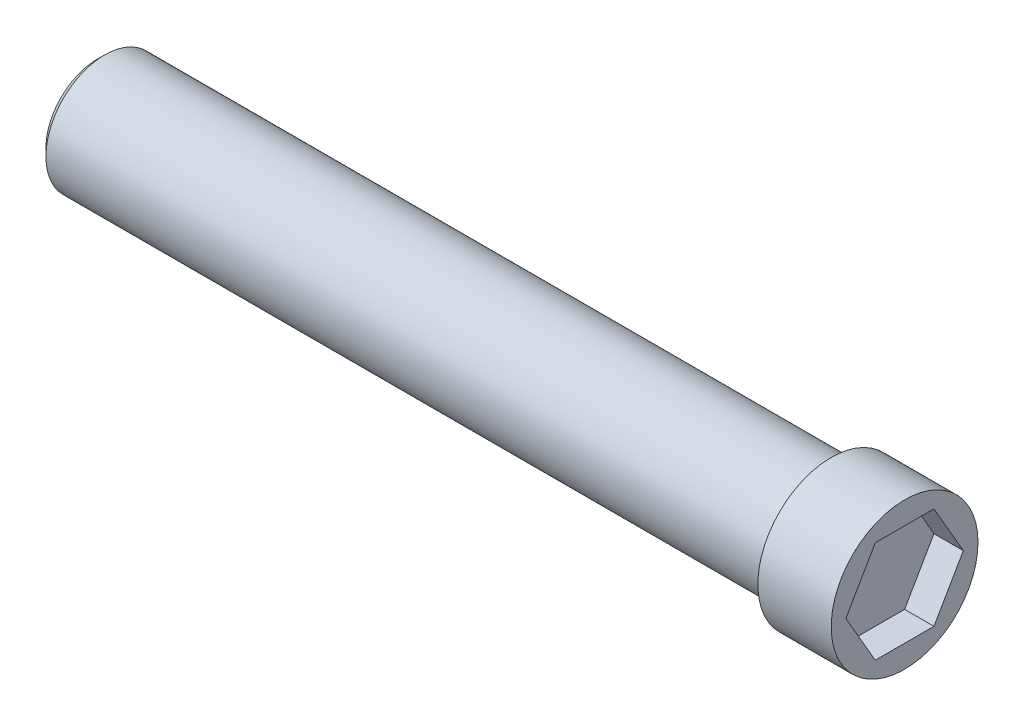
ISO-10303-21;
HEADER;
FILE_DESCRIPTION(('STEP AP214'),'2;1');
FILE_NAME('part.step','',(''),(''),'','','');
FILE_SCHEMA(('AUTOMOTIVE_DESIGN { 1 0 10303 214 1 1 1 1 }'));
ENDSEC;
DATA;
#1=APPLICATION_CONTEXT('core data for automotive mechanical design processes');
#2=APPLICATION_PROTOCOL_DEFINITION('international standard','automotive_design',2000,#1);
#3=PRODUCT_CONTEXT('',#1,'mechanical');
#4=PRODUCT('Part','Part','',(#3));
#5=PRODUCT_RELATED_PRODUCT_CATEGORY('part','',(#4));
#6=PRODUCT_DEFINITION_FORMATION('','',#4);
#7=PRODUCT_DEFINITION_CONTEXT('part definition',#1,'design');
#8=PRODUCT_DEFINITION('design','',#6,#7);
#9=PRODUCT_DEFINITION_SHAPE('','',#8);
#10=(LENGTH_UNIT() NAMED_UNIT(*) SI_UNIT(.MILLI.,.METRE.));
#11=(NAMED_UNIT(*) PLANE_ANGLE_UNIT() SI_UNIT($,.RADIAN.));
#12=(NAMED_UNIT(*) SI_UNIT($,.STERADIAN.) SOLID_ANGLE_UNIT());
#13=UNCERTAINTY_MEASURE_WITH_UNIT(LENGTH_MEASURE(1.E-05),#10,'distance_accuracy_value','');
#14=(GEOMETRIC_REPRESENTATION_CONTEXT(3) GLOBAL_UNCERTAINTY_ASSIGNED_CONTEXT((#13)) GLOBAL_UNIT_ASSIGNED_CONTEXT((#10,
#11,#12)) REPRESENTATION_CONTEXT('',''));
#15=CARTESIAN_POINT('',(0.,0.,0.));
#16=DIRECTION('',(0.,0.,1.));
#17=DIRECTION('',(1.,0.,0.));
#18=AXIS2_PLACEMENT_3D('',#15,#16,#17);
#19=CARTESIAN_POINT('',(50.,0.,0.));
#20=DIRECTION('',(-1.,0.,0.));
#21=DIRECTION('',(0.,0.,1.));
#22=AXIS2_PLACEMENT_3D('',#19,#20,#21);
#23=CYLINDRICAL_SURFACE('',#22,4.);
#24=CARTESIAN_POINT('',(0.5,0.,0.));
#25=DIRECTION('',(1.,0.,0.));
#26=DIRECTION('',(0.,0.,-1.));
#27=AXIS2_PLACEMENT_3D('',#24,#25,#26);
#28=CIRCLE('',#27,4.);
#29=CARTESIAN_POINT('',(0.5,0.,-4.));
#30=VERTEX_POINT('',#29);
#31=EDGE_CURVE('E43',#30,#30,#28,.T.);
#32=ORIENTED_EDGE('',*,*,#31,.T.);
#33=EDGE_LOOP('',(#32));
#34=FACE_BOUND('',#33,.T.);
#35=CARTESIAN_POINT('',(50.,0.,0.));
#36=DIRECTION('',(1.,0.,0.));
#37=DIRECTION('',(0.,0.,-1.));
#38=AXIS2_PLACEMENT_3D('',#35,#36,#37);
#39=CIRCLE('',#38,4.);
#40=CARTESIAN_POINT('',(50.,0.,-4.));
#41=VERTEX_POINT('',#40);
#42=EDGE_CURVE('E146',#41,#41,#39,.T.);
#43=ORIENTED_EDGE('',*,*,#42,.F.);
#44=EDGE_LOOP('',(#43));
#45=FACE_BOUND('',#44,.T.);
#46=ADVANCED_FACE('F35',(#34,#45),#23,.T.);
#47=CARTESIAN_POINT('',(0.,0.,0.));
#48=DIRECTION('',(1.,0.,0.));
#49=DIRECTION('',(0.,0.,-1.));
#50=AXIS2_PLACEMENT_3D('',#47,#48,#49);
#51=PLANE('',#50);
#52=CARTESIAN_POINT('',(0.,0.,0.));
#53=DIRECTION('',(1.,0.,0.));
#54=DIRECTION('',(0.,0.,-1.));
#55=AXIS2_PLACEMENT_3D('',#52,#53,#54);
#56=CIRCLE('',#55,3.5);
#57=CARTESIAN_POINT('',(0.,0.,-3.5));
#58=VERTEX_POINT('',#57);
#59=EDGE_CURVE('E11',#58,#58,#56,.F.);
#60=ORIENTED_EDGE('',*,*,#59,.T.);
#61=EDGE_LOOP('',(#60));
#62=FACE_BOUND('',#61,.T.);
#63=ADVANCED_FACE('F164',(#62),#51,.F.);
#64=CARTESIAN_POINT('',(50.,0.,0.));
#65=DIRECTION('',(1.,0.,0.));
#66=DIRECTION('',(0.,0.,-1.));
#67=AXIS2_PLACEMENT_3D('',#64,#65,#66);
#68=PLANE('',#67);
#69=CARTESIAN_POINT('',(50.,0.,0.));
#70=DIRECTION('',(1.,0.,0.));
#71=DIRECTION('',(0.,0.,-1.));
#72=AXIS2_PLACEMENT_3D('',#69,#70,#71);
#73=CIRCLE('',#72,5.);
#74=CARTESIAN_POINT('',(50.,0.,-5.));
#75=VERTEX_POINT('',#74);
#76=EDGE_CURVE('E137',#75,#75,#73,.T.);
#77=ORIENTED_EDGE('',*,*,#76,.F.);
#78=EDGE_LOOP('',(#77));
#79=FACE_BOUND('',#78,.T.);
#80=ORIENTED_EDGE('',*,*,#42,.T.);
#81=EDGE_LOOP('',(#80));
#82=FACE_BOUND('',#81,.T.);
#83=ADVANCED_FACE('F168',(#79,#82),#68,.F.);
#84=CARTESIAN_POINT('',(55.,0.,0.));
#85=DIRECTION('',(-1.,0.,0.));
#86=DIRECTION('',(0.,0.,1.));
#87=AXIS2_PLACEMENT_3D('',#84,#85,#86);
#88=CYLINDRICAL_SURFACE('',#87,5.);
#89=CARTESIAN_POINT('',(55.,0.,0.));
#90=DIRECTION('',(1.,0.,0.));
#91=DIRECTION('',(0.,0.,-1.));
#92=AXIS2_PLACEMENT_3D('',#89,#90,#91);
#93=CIRCLE('',#92,5.);
#94=CARTESIAN_POINT('',(55.,0.,-5.));
#95=VERTEX_POINT('',#94);
#96=EDGE_CURVE('E143',#95,#95,#93,.T.);
#97=ORIENTED_EDGE('',*,*,#96,.F.);
#98=EDGE_LOOP('',(#97));
#99=FACE_BOUND('',#98,.T.);
#100=ORIENTED_EDGE('',*,*,#76,.T.);
#101=EDGE_LOOP('',(#100));
#102=FACE_BOUND('',#101,.T.);
#103=ADVANCED_FACE('F172',(#99,#102),#88,.T.);
#104=CARTESIAN_POINT('',(55.,0.,0.));
#105=DIRECTION('',(1.,0.,0.));
#106=DIRECTION('',(0.,0.,-1.));
#107=AXIS2_PLACEMENT_3D('',#104,#105,#106);
#108=PLANE('',#107);
#109=DIRECTION('',(0.,0.866025403784439,-0.5));
#110=VECTOR('',#109,1.);
#111=CARTESIAN_POINT('',(55.,-3.46410161513775,-2.));
#112=LINE('',#111,#110);
#113=CARTESIAN_POINT('',(55.,-3.46410161513775,-2.));
#114=VERTEX_POINT('',#113);
#115=CARTESIAN_POINT('',(55.,0.,-4.));
#116=VERTEX_POINT('',#115);
#117=EDGE_CURVE('E50',#114,#116,#112,.T.);
#118=ORIENTED_EDGE('',*,*,#117,.F.);
#119=DIRECTION('',(0.,0.,-1.));
#120=VECTOR('',#119,1.);
#121=CARTESIAN_POINT('',(55.,-3.46410161513775,2.));
#122=LINE('',#121,#120);
#123=CARTESIAN_POINT('',(55.,-3.46410161513775,2.));
#124=VERTEX_POINT('',#123);
#125=EDGE_CURVE('E133',#124,#114,#122,.T.);
#126=ORIENTED_EDGE('',*,*,#125,.F.);
#127=DIRECTION('',(0.,-0.866025403784439,-0.5));
#128=VECTOR('',#127,1.);
#129=CARTESIAN_POINT('',(55.,0.,4.));
#130=LINE('',#129,#128);
#131=CARTESIAN_POINT('',(55.,0.,4.));
#132=VERTEX_POINT('',#131);
#133=EDGE_CURVE('E131',#132,#124,#130,.T.);
#134=ORIENTED_EDGE('',*,*,#133,.F.);
#135=DIRECTION('',(0.,-0.866025403784439,0.5));
#136=VECTOR('',#135,1.);
#137=CARTESIAN_POINT('',(55.,3.46410161513776,2.));
#138=LINE('',#137,#136);
#139=CARTESIAN_POINT('',(55.,3.46410161513776,2.));
#140=VERTEX_POINT('',#139);
#141=EDGE_CURVE('E98',#140,#132,#138,.T.);
#142=ORIENTED_EDGE('',*,*,#141,.F.);
#143=DIRECTION('',(0.,0.,1.));
#144=VECTOR('',#143,1.);
#145=CARTESIAN_POINT('',(55.,3.46410161513776,-2.));
#146=LINE('',#145,#144);
#147=CARTESIAN_POINT('',(55.,3.46410161513776,-2.));
#148=VERTEX_POINT('',#147);
#149=EDGE_CURVE('E127',#148,#140,#146,.T.);
#150=ORIENTED_EDGE('',*,*,#149,.F.);
#151=DIRECTION('',(0.,0.866025403784439,0.5));
#152=VECTOR('',#151,1.);
#153=CARTESIAN_POINT('',(55.,0.,-4.));
#154=LINE('',#153,#152);
#155=EDGE_CURVE('E124',#116,#148,#154,.T.);
#156=ORIENTED_EDGE('',*,*,#155,.F.);
#157=EDGE_LOOP('',(#118,#126,#134,#142,#150,#156));
#158=FACE_BOUND('',#157,.T.);
#159=ORIENTED_EDGE('',*,*,#96,.T.);
#160=EDGE_LOOP('',(#159));
#161=FACE_BOUND('',#160,.T.);
#162=ADVANCED_FACE('F175',(#158,#161),#108,.T.);
#163=CARTESIAN_POINT('',(53.,-3.46410161513775,-2.));
#164=DIRECTION('',(0.,-0.5,-0.866025403784439));
#165=DIRECTION('',(0.,0.866025403784439,-0.5));
#166=AXIS2_PLACEMENT_3D('',#163,#164,#165);
#167=PLANE('',#166);
#168=ORIENTED_EDGE('',*,*,#117,.T.);
#169=DIRECTION('',(1.,0.,0.));
#170=VECTOR('',#169,1.);
#171=CARTESIAN_POINT('',(53.,0.,-4.));
#172=LINE('',#171,#170);
#173=CARTESIAN_POINT('',(53.,0.,-4.));
#174=VERTEX_POINT('',#173);
#175=EDGE_CURVE('E80',#174,#116,#172,.T.);
#176=ORIENTED_EDGE('',*,*,#175,.F.);
#177=DIRECTION('',(0.,0.866025403784439,-0.5));
#178=VECTOR('',#177,1.);
#179=CARTESIAN_POINT('',(53.,-3.46410161513775,-2.));
#180=LINE('',#179,#178);
#181=CARTESIAN_POINT('',(53.,-3.46410161513775,-2.));
#182=VERTEX_POINT('',#181);
#183=EDGE_CURVE('E135',#182,#174,#180,.T.);
#184=ORIENTED_EDGE('',*,*,#183,.F.);
#185=DIRECTION('',(1.,0.,0.));
#186=VECTOR('',#185,1.);
#187=CARTESIAN_POINT('',(53.,-3.46410161513775,-2.));
#188=LINE('',#187,#186);
#189=EDGE_CURVE('E58',#182,#114,#188,.T.);
#190=ORIENTED_EDGE('',*,*,#189,.T.);
#191=EDGE_LOOP('',(#168,#176,#184,#190));
#192=FACE_BOUND('',#191,.T.);
#193=ADVANCED_FACE('F182',(#192),#167,.F.);
#194=CARTESIAN_POINT('',(53.,-3.46410161513775,2.));
#195=DIRECTION('',(0.,-1.,0.));
#196=DIRECTION('',(0.,0.,-1.));
#197=AXIS2_PLACEMENT_3D('',#194,#195,#196);
#198=PLANE('',#197);
#199=ORIENTED_EDGE('',*,*,#125,.T.);
#200=ORIENTED_EDGE('',*,*,#189,.F.);
#201=DIRECTION('',(0.,0.,-1.));
#202=VECTOR('',#201,1.);
#203=CARTESIAN_POINT('',(53.,-3.46410161513775,2.));
#204=LINE('',#203,#202);
#205=CARTESIAN_POINT('',(53.,-3.46410161513775,2.));
#206=VERTEX_POINT('',#205);
#207=EDGE_CURVE('E110',#206,#182,#204,.T.);
#208=ORIENTED_EDGE('',*,*,#207,.F.);
#209=DIRECTION('',(1.,0.,0.));
#210=VECTOR('',#209,1.);
#211=CARTESIAN_POINT('',(53.,-3.46410161513775,2.));
#212=LINE('',#211,#210);
#213=EDGE_CURVE('E102',#206,#124,#212,.T.);
#214=ORIENTED_EDGE('',*,*,#213,.T.);
#215=EDGE_LOOP('',(#199,#200,#208,#214));
#216=FACE_BOUND('',#215,.T.);
#217=ADVANCED_FACE('F186',(#216),#198,.F.);
#218=CARTESIAN_POINT('',(53.,0.,4.));
#219=DIRECTION('',(0.,-0.5,0.866025403784439));
#220=DIRECTION('',(0.,-0.866025403784439,-0.5));
#221=AXIS2_PLACEMENT_3D('',#218,#219,#220);
#222=PLANE('',#221);
#223=ORIENTED_EDGE('',*,*,#133,.T.);
#224=ORIENTED_EDGE('',*,*,#213,.F.);
#225=DIRECTION('',(0.,-0.866025403784439,-0.5));
#226=VECTOR('',#225,1.);
#227=CARTESIAN_POINT('',(53.,0.,4.));
#228=LINE('',#227,#226);
#229=CARTESIAN_POINT('',(53.,0.,4.));
#230=VERTEX_POINT('',#229);
#231=EDGE_CURVE('E106',#230,#206,#228,.T.);
#232=ORIENTED_EDGE('',*,*,#231,.F.);
#233=DIRECTION('',(1.,0.,0.));
#234=VECTOR('',#233,1.);
#235=CARTESIAN_POINT('',(53.,0.,4.));
#236=LINE('',#235,#234);
#237=EDGE_CURVE('E91',#230,#132,#236,.T.);
#238=ORIENTED_EDGE('',*,*,#237,.T.);
#239=EDGE_LOOP('',(#223,#224,#232,#238));
#240=FACE_BOUND('',#239,.T.);
#241=ADVANCED_FACE('F107',(#240),#222,.F.);
#242=CARTESIAN_POINT('',(53.,3.46410161513776,2.));
#243=DIRECTION('',(0.,0.5,0.866025403784439));
#244=DIRECTION('',(0.,-0.866025403784439,0.5));
#245=AXIS2_PLACEMENT_3D('',#242,#243,#244);
#246=PLANE('',#245);
#247=ORIENTED_EDGE('',*,*,#141,.T.);
#248=ORIENTED_EDGE('',*,*,#237,.F.);
#249=DIRECTION('',(0.,-0.866025403784439,0.5));
#250=VECTOR('',#249,1.);
#251=CARTESIAN_POINT('',(53.,3.46410161513776,2.));
#252=LINE('',#251,#250);
#253=CARTESIAN_POINT('',(53.,3.46410161513776,2.));
#254=VERTEX_POINT('',#253);
#255=EDGE_CURVE('E95',#254,#230,#252,.T.);
#256=ORIENTED_EDGE('',*,*,#255,.F.);
#257=DIRECTION('',(1.,0.,0.));
#258=VECTOR('',#257,1.);
#259=CARTESIAN_POINT('',(53.,3.46410161513776,2.));
#260=LINE('',#259,#258);
#261=EDGE_CURVE('E103',#254,#140,#260,.T.);
#262=ORIENTED_EDGE('',*,*,#261,.T.);
#263=EDGE_LOOP('',(#247,#248,#256,#262));
#264=FACE_BOUND('',#263,.T.);
#265=ADVANCED_FACE('F93',(#264),#246,.F.);
#266=CARTESIAN_POINT('',(53.,3.46410161513776,-2.));
#267=DIRECTION('',(0.,1.,0.));
#268=DIRECTION('',(0.,0.,1.));
#269=AXIS2_PLACEMENT_3D('',#266,#267,#268);
#270=PLANE('',#269);
#271=ORIENTED_EDGE('',*,*,#149,.T.);
#272=ORIENTED_EDGE('',*,*,#261,.F.);
#273=DIRECTION('',(0.,0.,1.));
#274=VECTOR('',#273,1.);
#275=CARTESIAN_POINT('',(53.,3.46410161513776,-2.));
#276=LINE('',#275,#274);
#277=CARTESIAN_POINT('',(53.,3.46410161513776,-2.));
#278=VERTEX_POINT('',#277);
#279=EDGE_CURVE('E116',#278,#254,#276,.T.);
#280=ORIENTED_EDGE('',*,*,#279,.F.);
#281=DIRECTION('',(1.,0.,0.));
#282=VECTOR('',#281,1.);
#283=CARTESIAN_POINT('',(53.,3.46410161513776,-2.));
#284=LINE('',#283,#282);
#285=EDGE_CURVE('E140',#278,#148,#284,.T.);
#286=ORIENTED_EDGE('',*,*,#285,.T.);
#287=EDGE_LOOP('',(#271,#272,#280,#286));
#288=FACE_BOUND('',#287,.T.);
#289=ADVANCED_FACE('F189',(#288),#270,.F.);
#290=CARTESIAN_POINT('',(53.,0.,-4.));
#291=DIRECTION('',(0.,0.5,-0.866025403784439));
#292=DIRECTION('',(0.,0.866025403784439,0.5));
#293=AXIS2_PLACEMENT_3D('',#290,#291,#292);
#294=PLANE('',#293);
#295=ORIENTED_EDGE('',*,*,#155,.T.);
#296=ORIENTED_EDGE('',*,*,#285,.F.);
#297=DIRECTION('',(0.,0.866025403784439,0.5));
#298=VECTOR('',#297,1.);
#299=CARTESIAN_POINT('',(53.,0.,-4.));
#300=LINE('',#299,#298);
#301=EDGE_CURVE('E118',#174,#278,#300,.T.);
#302=ORIENTED_EDGE('',*,*,#301,.F.);
#303=ORIENTED_EDGE('',*,*,#175,.T.);
#304=EDGE_LOOP('',(#295,#296,#302,#303));
#305=FACE_BOUND('',#304,.T.);
#306=ADVANCED_FACE('F160',(#305),#294,.F.);
#307=CARTESIAN_POINT('',(53.,0.,0.));
#308=DIRECTION('',(1.,0.,0.));
#309=DIRECTION('',(0.,0.,-1.));
#310=AXIS2_PLACEMENT_3D('',#307,#308,#309);
#311=PLANE('',#310);
#312=ORIENTED_EDGE('',*,*,#183,.T.);
#313=ORIENTED_EDGE('',*,*,#301,.T.);
#314=ORIENTED_EDGE('',*,*,#279,.T.);
#315=ORIENTED_EDGE('',*,*,#255,.T.);
#316=ORIENTED_EDGE('',*,*,#231,.T.);
#317=ORIENTED_EDGE('',*,*,#207,.T.);
#318=EDGE_LOOP('',(#312,#313,#314,#315,#316,#317));
#319=FACE_BOUND('',#318,.T.);
#320=ADVANCED_FACE('F113',(#319),#311,.T.);
#321=CARTESIAN_POINT('',(0.5,0.,0.));
#322=DIRECTION('',(1.,0.,0.));
#323=DIRECTION('',(0.,0.,-1.));
#324=AXIS2_PLACEMENT_3D('',#321,#322,#323);
#325=CONICAL_SURFACE('',#324,4.,0.785398163397445);
#326=ORIENTED_EDGE('',*,*,#59,.F.);
#327=EDGE_LOOP('',(#326));
#328=FACE_BOUND('',#327,.T.);
#329=ORIENTED_EDGE('',*,*,#31,.F.);
#330=EDGE_LOOP('',(#329));
#331=FACE_BOUND('',#330,.T.);
#332=ADVANCED_FACE('F37',(#328,#331),#325,.T.);
#333=CLOSED_SHELL('',(#46,#63,#83,#103,#162,#193,#217,#241,#265,#289,#306,#320,#332));
#334=MANIFOLD_SOLID_BREP('B2',#333);
#335=ADVANCED_BREP_SHAPE_REPRESENTATION('',(#18,#334),#14);
#336=SHAPE_DEFINITION_REPRESENTATION(#9,#335);
ENDSEC;
END-ISO-10303-21;
